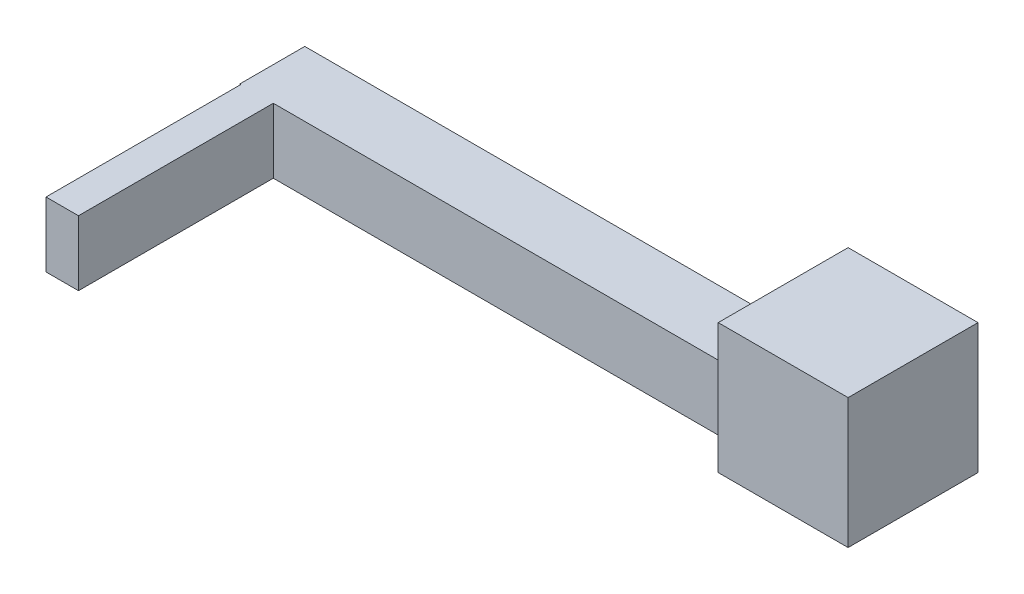
ISO-10303-21;
HEADER;
FILE_DESCRIPTION(('STEP AP214'),'2;1');
FILE_NAME('part.step','',(''),(''),'','','');
FILE_SCHEMA(('AUTOMOTIVE_DESIGN { 1 0 10303 214 1 1 1 1 }'));
ENDSEC;
DATA;
#1=APPLICATION_CONTEXT('core data for automotive mechanical design processes');
#2=APPLICATION_PROTOCOL_DEFINITION('international standard','automotive_design',2000,#1);
#3=PRODUCT_CONTEXT('',#1,'mechanical');
#4=PRODUCT('Part','Part','',(#3));
#5=PRODUCT_RELATED_PRODUCT_CATEGORY('part','',(#4));
#6=PRODUCT_DEFINITION_FORMATION('','',#4);
#7=PRODUCT_DEFINITION_CONTEXT('part definition',#1,'design');
#8=PRODUCT_DEFINITION('design','',#6,#7);
#9=PRODUCT_DEFINITION_SHAPE('','',#8);
#10=(LENGTH_UNIT() NAMED_UNIT(*) SI_UNIT(.MILLI.,.METRE.));
#11=(NAMED_UNIT(*) PLANE_ANGLE_UNIT() SI_UNIT($,.RADIAN.));
#12=(NAMED_UNIT(*) SI_UNIT($,.STERADIAN.) SOLID_ANGLE_UNIT());
#13=UNCERTAINTY_MEASURE_WITH_UNIT(LENGTH_MEASURE(1.E-05),#10,'distance_accuracy_value','');
#14=(GEOMETRIC_REPRESENTATION_CONTEXT(3) GLOBAL_UNCERTAINTY_ASSIGNED_CONTEXT((#13)) GLOBAL_UNIT_ASSIGNED_CONTEXT((#10,
#11,#12)) REPRESENTATION_CONTEXT('',''));
#15=CARTESIAN_POINT('',(0.,0.,0.));
#16=DIRECTION('',(0.,0.,1.));
#17=DIRECTION('',(1.,0.,0.));
#18=AXIS2_PLACEMENT_3D('',#15,#16,#17);
#19=CARTESIAN_POINT('',(40.,10.,5.));
#20=DIRECTION('',(0.,0.,-1.));
#21=DIRECTION('',(-1.,0.,0.));
#22=AXIS2_PLACEMENT_3D('',#19,#20,#21);
#23=PLANE('',#22);
#24=DIRECTION('',(0.,-1.,0.));
#25=VECTOR('',#24,1.);
#26=CARTESIAN_POINT('',(-39.8451970487685,10.,5.00000000000001));
#27=LINE('',#26,#25);
#28=CARTESIAN_POINT('',(-39.8451970487685,10.,5.00000000000001));
#29=VERTEX_POINT('',#28);
#30=CARTESIAN_POINT('',(-39.8451970487685,0.,5.00000000000001));
#31=VERTEX_POINT('',#30);
#32=EDGE_CURVE('E56',#29,#31,#27,.T.);
#33=ORIENTED_EDGE('',*,*,#32,.F.);
#34=DIRECTION('',(1.,0.,0.));
#35=VECTOR('',#34,1.);
#36=CARTESIAN_POINT('',(40.,10.,5.));
#37=LINE('',#36,#35);
#38=CARTESIAN_POINT('',(-40.,10.,5.00000000000001));
#39=VERTEX_POINT('',#38);
#40=EDGE_CURVE('E140',#39,#29,#37,.T.);
#41=ORIENTED_EDGE('',*,*,#40,.F.);
#42=DIRECTION('',(0.,-1.,0.));
#43=VECTOR('',#42,1.);
#44=CARTESIAN_POINT('',(-40.,10.,5.00000000000001));
#45=LINE('',#44,#43);
#46=CARTESIAN_POINT('',(-40.,0.,5.00000000000001));
#47=VERTEX_POINT('',#46);
#48=EDGE_CURVE('E168',#39,#47,#45,.T.);
#49=ORIENTED_EDGE('',*,*,#48,.T.);
#50=DIRECTION('',(1.,0.,0.));
#51=VECTOR('',#50,1.);
#52=CARTESIAN_POINT('',(40.,0.,5.));
#53=LINE('',#52,#51);
#54=EDGE_CURVE('E163',#47,#31,#53,.T.);
#55=ORIENTED_EDGE('',*,*,#54,.T.);
#56=EDGE_LOOP('',(#33,#41,#49,#55));
#57=FACE_BOUND('',#56,.T.);
#58=ADVANCED_FACE('F33',(#57),#23,.F.);
#59=DIRECTION('',(0.,-1.,0.));
#60=VECTOR('',#59,1.);
#61=CARTESIAN_POINT('',(-34.8451970487685,10.,5.00000000000001));
#62=LINE('',#61,#60);
#63=CARTESIAN_POINT('',(-34.8451970487685,10.,5.00000000000001));
#64=VERTEX_POINT('',#63);
#65=CARTESIAN_POINT('',(-34.8451970487685,0.,5.00000000000001));
#66=VERTEX_POINT('',#65);
#67=EDGE_CURVE('E152',#64,#66,#62,.T.);
#68=ORIENTED_EDGE('',*,*,#67,.T.);
#69=CARTESIAN_POINT('',(38.6544418153938,0.,5.));
#70=VERTEX_POINT('',#69);
#71=EDGE_CURVE('E150',#66,#70,#53,.T.);
#72=ORIENTED_EDGE('',*,*,#71,.T.);
#73=DIRECTION('',(0.,1.,0.));
#74=VECTOR('',#73,1.);
#75=CARTESIAN_POINT('',(38.6544418153938,20.,5.));
#76=LINE('',#75,#74);
#77=CARTESIAN_POINT('',(38.6544418153938,10.,5.00000000000001));
#78=VERTEX_POINT('',#77);
#79=EDGE_CURVE('E174',#70,#78,#76,.T.);
#80=ORIENTED_EDGE('',*,*,#79,.T.);
#81=EDGE_CURVE('E48',#64,#78,#37,.T.);
#82=ORIENTED_EDGE('',*,*,#81,.F.);
#83=EDGE_LOOP('',(#68,#72,#80,#82));
#84=FACE_BOUND('',#83,.T.);
#85=ADVANCED_FACE('F237',(#84),#23,.F.);
#86=CARTESIAN_POINT('',(38.6544418153938,20.,10.));
#87=DIRECTION('',(1.,0.,0.));
#88=DIRECTION('',(0.,0.,-1.));
#89=AXIS2_PLACEMENT_3D('',#86,#87,#88);
#90=PLANE('',#89);
#91=ORIENTED_EDGE('',*,*,#79,.F.);
#92=DIRECTION('',(0.,0.,1.));
#93=VECTOR('',#92,1.);
#94=CARTESIAN_POINT('',(38.6544418153938,0.,10.));
#95=LINE('',#94,#93);
#96=CARTESIAN_POINT('',(38.6544418153938,0.,10.));
#97=VERTEX_POINT('',#96);
#98=EDGE_CURVE('E176',#70,#97,#95,.T.);
#99=ORIENTED_EDGE('',*,*,#98,.T.);
#100=DIRECTION('',(0.,-1.,0.));
#101=VECTOR('',#100,1.);
#102=CARTESIAN_POINT('',(38.6544418153938,20.,10.));
#103=LINE('',#102,#101);
#104=CARTESIAN_POINT('',(38.6544418153938,20.,10.));
#105=VERTEX_POINT('',#104);
#106=EDGE_CURVE('E41',#105,#97,#103,.T.);
#107=ORIENTED_EDGE('',*,*,#106,.F.);
#108=DIRECTION('',(0.,0.,1.));
#109=VECTOR('',#108,1.);
#110=CARTESIAN_POINT('',(38.6544418153938,20.,10.));
#111=LINE('',#110,#109);
#112=CARTESIAN_POINT('',(38.6544418153938,20.,-10.));
#113=VERTEX_POINT('',#112);
#114=EDGE_CURVE('E177',#113,#105,#111,.T.);
#115=ORIENTED_EDGE('',*,*,#114,.F.);
#116=DIRECTION('',(0.,-1.,0.));
#117=VECTOR('',#116,1.);
#118=CARTESIAN_POINT('',(38.6544418153938,20.,-10.));
#119=LINE('',#118,#117);
#120=CARTESIAN_POINT('',(38.6544418153938,0.,-10.));
#121=VERTEX_POINT('',#120);
#122=EDGE_CURVE('E187',#113,#121,#119,.T.);
#123=ORIENTED_EDGE('',*,*,#122,.T.);
#124=CARTESIAN_POINT('',(38.6544418153938,0.,-5.));
#125=VERTEX_POINT('',#124);
#126=EDGE_CURVE('E188',#121,#125,#95,.T.);
#127=ORIENTED_EDGE('',*,*,#126,.T.);
#128=DIRECTION('',(0.,-1.,0.));
#129=VECTOR('',#128,1.);
#130=CARTESIAN_POINT('',(38.6544418153938,20.,-5.));
#131=LINE('',#130,#129);
#132=CARTESIAN_POINT('',(38.6544418153938,10.,-5.));
#133=VERTEX_POINT('',#132);
#134=EDGE_CURVE('E171',#133,#125,#131,.T.);
#135=ORIENTED_EDGE('',*,*,#134,.F.);
#136=DIRECTION('',(0.,0.,1.));
#137=VECTOR('',#136,1.);
#138=CARTESIAN_POINT('',(38.6544418153938,10.,10.));
#139=LINE('',#138,#137);
#140=EDGE_CURVE('E11',#133,#78,#139,.T.);
#141=ORIENTED_EDGE('',*,*,#140,.T.);
#142=EDGE_LOOP('',(#91,#99,#107,#115,#123,#127,#135,#141));
#143=FACE_BOUND('',#142,.T.);
#144=ADVANCED_FACE('F35',(#143),#90,.F.);
#145=CARTESIAN_POINT('',(58.6544418153938,20.,10.));
#146=DIRECTION('',(0.,0.,-1.));
#147=DIRECTION('',(-1.,0.,0.));
#148=AXIS2_PLACEMENT_3D('',#145,#146,#147);
#149=PLANE('',#148);
#150=DIRECTION('',(1.,0.,0.));
#151=VECTOR('',#150,1.);
#152=CARTESIAN_POINT('',(58.6544418153938,0.,10.));
#153=LINE('',#152,#151);
#154=CARTESIAN_POINT('',(58.6544418153938,0.,10.));
#155=VERTEX_POINT('',#154);
#156=EDGE_CURVE('E190',#97,#155,#153,.T.);
#157=ORIENTED_EDGE('',*,*,#156,.T.);
#158=DIRECTION('',(0.,-1.,0.));
#159=VECTOR('',#158,1.);
#160=CARTESIAN_POINT('',(58.6544418153938,20.,10.));
#161=LINE('',#160,#159);
#162=CARTESIAN_POINT('',(58.6544418153938,20.,10.));
#163=VERTEX_POINT('',#162);
#164=EDGE_CURVE('E200',#163,#155,#161,.T.);
#165=ORIENTED_EDGE('',*,*,#164,.F.);
#166=DIRECTION('',(1.,0.,0.));
#167=VECTOR('',#166,1.);
#168=CARTESIAN_POINT('',(58.6544418153938,20.,10.));
#169=LINE('',#168,#167);
#170=EDGE_CURVE('E180',#105,#163,#169,.T.);
#171=ORIENTED_EDGE('',*,*,#170,.F.);
#172=ORIENTED_EDGE('',*,*,#106,.T.);
#173=EDGE_LOOP('',(#157,#165,#171,#172));
#174=FACE_BOUND('',#173,.T.);
#175=ADVANCED_FACE('F205',(#174),#149,.F.);
#176=CARTESIAN_POINT('',(58.6544418153938,20.,10.));
#177=DIRECTION('',(-1.,0.,0.));
#178=DIRECTION('',(0.,0.,1.));
#179=AXIS2_PLACEMENT_3D('',#176,#177,#178);
#180=PLANE('',#179);
#181=DIRECTION('',(0.,0.,-1.));
#182=VECTOR('',#181,1.);
#183=CARTESIAN_POINT('',(58.6544418153938,0.,10.));
#184=LINE('',#183,#182);
#185=CARTESIAN_POINT('',(58.6544418153938,0.,-10.));
#186=VERTEX_POINT('',#185);
#187=EDGE_CURVE('E192',#155,#186,#184,.T.);
#188=ORIENTED_EDGE('',*,*,#187,.T.);
#189=DIRECTION('',(0.,-1.,0.));
#190=VECTOR('',#189,1.);
#191=CARTESIAN_POINT('',(58.6544418153938,20.,-10.));
#192=LINE('',#191,#190);
#193=CARTESIAN_POINT('',(58.6544418153938,20.,-10.));
#194=VERTEX_POINT('',#193);
#195=EDGE_CURVE('E197',#194,#186,#192,.T.);
#196=ORIENTED_EDGE('',*,*,#195,.F.);
#197=DIRECTION('',(0.,0.,-1.));
#198=VECTOR('',#197,1.);
#199=CARTESIAN_POINT('',(58.6544418153938,20.,10.));
#200=LINE('',#199,#198);
#201=EDGE_CURVE('E183',#163,#194,#200,.T.);
#202=ORIENTED_EDGE('',*,*,#201,.F.);
#203=ORIENTED_EDGE('',*,*,#164,.T.);
#204=EDGE_LOOP('',(#188,#196,#202,#203));
#205=FACE_BOUND('',#204,.T.);
#206=ADVANCED_FACE('F219',(#205),#180,.F.);
#207=CARTESIAN_POINT('',(58.6544418153938,20.,-10.));
#208=DIRECTION('',(0.,0.,1.));
#209=DIRECTION('',(1.,0.,0.));
#210=AXIS2_PLACEMENT_3D('',#207,#208,#209);
#211=PLANE('',#210);
#212=DIRECTION('',(-1.,0.,0.));
#213=VECTOR('',#212,1.);
#214=CARTESIAN_POINT('',(58.6544418153938,0.,-10.));
#215=LINE('',#214,#213);
#216=EDGE_CURVE('E181',#186,#121,#215,.T.);
#217=ORIENTED_EDGE('',*,*,#216,.T.);
#218=ORIENTED_EDGE('',*,*,#122,.F.);
#219=DIRECTION('',(-1.,0.,0.));
#220=VECTOR('',#219,1.);
#221=CARTESIAN_POINT('',(58.6544418153938,20.,-10.));
#222=LINE('',#221,#220);
#223=EDGE_CURVE('E185',#194,#113,#222,.T.);
#224=ORIENTED_EDGE('',*,*,#223,.F.);
#225=ORIENTED_EDGE('',*,*,#195,.T.);
#226=EDGE_LOOP('',(#217,#218,#224,#225));
#227=FACE_BOUND('',#226,.T.);
#228=ADVANCED_FACE('F223',(#227),#211,.F.);
#229=CARTESIAN_POINT('',(0.,20.,0.));
#230=DIRECTION('',(0.,1.,0.));
#231=DIRECTION('',(0.,0.,1.));
#232=AXIS2_PLACEMENT_3D('',#229,#230,#231);
#233=PLANE('',#232);
#234=ORIENTED_EDGE('',*,*,#114,.T.);
#235=ORIENTED_EDGE('',*,*,#170,.T.);
#236=ORIENTED_EDGE('',*,*,#201,.T.);
#237=ORIENTED_EDGE('',*,*,#223,.T.);
#238=EDGE_LOOP('',(#234,#235,#236,#237));
#239=FACE_BOUND('',#238,.T.);
#240=ADVANCED_FACE('F226',(#239),#233,.T.);
#241=CARTESIAN_POINT('',(0.,0.,0.));
#242=DIRECTION('',(0.,1.,0.));
#243=DIRECTION('',(0.,0.,1.));
#244=AXIS2_PLACEMENT_3D('',#241,#242,#243);
#245=PLANE('',#244);
#246=ORIENTED_EDGE('',*,*,#98,.F.);
#247=ORIENTED_EDGE('',*,*,#71,.F.);
#248=DIRECTION('',(0.,0.,-1.));
#249=VECTOR('',#248,1.);
#250=CARTESIAN_POINT('',(-34.8451970487685,0.,35.));
#251=LINE('',#250,#249);
#252=CARTESIAN_POINT('',(-34.8451970487685,0.,35.));
#253=VERTEX_POINT('',#252);
#254=EDGE_CURVE('E142',#253,#66,#251,.T.);
#255=ORIENTED_EDGE('',*,*,#254,.F.);
#256=DIRECTION('',(1.,0.,0.));
#257=VECTOR('',#256,1.);
#258=CARTESIAN_POINT('',(-34.8451970487685,0.,35.));
#259=LINE('',#258,#257);
#260=CARTESIAN_POINT('',(-39.8451970487685,0.,35.));
#261=VERTEX_POINT('',#260);
#262=EDGE_CURVE('E263',#261,#253,#259,.T.);
#263=ORIENTED_EDGE('',*,*,#262,.F.);
#264=DIRECTION('',(0.,0.,1.));
#265=VECTOR('',#264,1.);
#266=CARTESIAN_POINT('',(-39.8451970487685,0.,35.));
#267=LINE('',#266,#265);
#268=EDGE_CURVE('E146',#31,#261,#267,.T.);
#269=ORIENTED_EDGE('',*,*,#268,.F.);
#270=ORIENTED_EDGE('',*,*,#54,.F.);
#271=DIRECTION('',(0.,0.,1.));
#272=VECTOR('',#271,1.);
#273=CARTESIAN_POINT('',(-40.,0.,5.00000000000001));
#274=LINE('',#273,#272);
#275=CARTESIAN_POINT('',(-40.,0.,-4.99999999999999));
#276=VERTEX_POINT('',#275);
#277=EDGE_CURVE('E147',#276,#47,#274,.T.);
#278=ORIENTED_EDGE('',*,*,#277,.F.);
#279=DIRECTION('',(-1.,0.,0.));
#280=VECTOR('',#279,1.);
#281=CARTESIAN_POINT('',(40.,0.,-5.));
#282=LINE('',#281,#280);
#283=EDGE_CURVE('E158',#125,#276,#282,.T.);
#284=ORIENTED_EDGE('',*,*,#283,.F.);
#285=ORIENTED_EDGE('',*,*,#126,.F.);
#286=ORIENTED_EDGE('',*,*,#216,.F.);
#287=ORIENTED_EDGE('',*,*,#187,.F.);
#288=ORIENTED_EDGE('',*,*,#156,.F.);
#289=EDGE_LOOP('',(#246,#247,#255,#263,#269,#270,#278,#284,#285,#286,#287,#288));
#290=FACE_BOUND('',#289,.T.);
#291=ADVANCED_FACE('F214',(#290),#245,.F.);
#292=CARTESIAN_POINT('',(0.,10.,0.));
#293=DIRECTION('',(0.,1.,0.));
#294=DIRECTION('',(0.,0.,1.));
#295=AXIS2_PLACEMENT_3D('',#292,#293,#294);
#296=PLANE('',#295);
#297=ORIENTED_EDGE('',*,*,#140,.F.);
#298=DIRECTION('',(-1.,0.,0.));
#299=VECTOR('',#298,1.);
#300=CARTESIAN_POINT('',(40.,10.,-5.));
#301=LINE('',#300,#299);
#302=CARTESIAN_POINT('',(-40.,10.,-4.99999999999999));
#303=VERTEX_POINT('',#302);
#304=EDGE_CURVE('E160',#133,#303,#301,.T.);
#305=ORIENTED_EDGE('',*,*,#304,.T.);
#306=DIRECTION('',(0.,0.,1.));
#307=VECTOR('',#306,1.);
#308=CARTESIAN_POINT('',(-40.,10.,5.00000000000001));
#309=LINE('',#308,#307);
#310=EDGE_CURVE('E156',#303,#39,#309,.T.);
#311=ORIENTED_EDGE('',*,*,#310,.T.);
#312=ORIENTED_EDGE('',*,*,#40,.T.);
#313=DIRECTION('',(0.,0.,1.));
#314=VECTOR('',#313,1.);
#315=CARTESIAN_POINT('',(-39.8451970487685,10.,35.));
#316=LINE('',#315,#314);
#317=CARTESIAN_POINT('',(-39.8451970487685,10.,35.));
#318=VERTEX_POINT('',#317);
#319=EDGE_CURVE('E134',#29,#318,#316,.T.);
#320=ORIENTED_EDGE('',*,*,#319,.T.);
#321=DIRECTION('',(1.,0.,0.));
#322=VECTOR('',#321,1.);
#323=CARTESIAN_POINT('',(-34.8451970487685,10.,35.));
#324=LINE('',#323,#322);
#325=CARTESIAN_POINT('',(-34.8451970487685,10.,35.));
#326=VERTEX_POINT('',#325);
#327=EDGE_CURVE('E123',#318,#326,#324,.T.);
#328=ORIENTED_EDGE('',*,*,#327,.T.);
#329=DIRECTION('',(0.,0.,-1.));
#330=VECTOR('',#329,1.);
#331=CARTESIAN_POINT('',(-34.8451970487685,10.,35.));
#332=LINE('',#331,#330);
#333=EDGE_CURVE('E133',#326,#64,#332,.T.);
#334=ORIENTED_EDGE('',*,*,#333,.T.);
#335=ORIENTED_EDGE('',*,*,#81,.T.);
#336=EDGE_LOOP('',(#297,#305,#311,#312,#320,#328,#334,#335));
#337=FACE_BOUND('',#336,.T.);
#338=ADVANCED_FACE('F138',(#337),#296,.T.);
#339=CARTESIAN_POINT('',(40.,10.,-5.));
#340=DIRECTION('',(0.,0.,1.));
#341=DIRECTION('',(1.,0.,0.));
#342=AXIS2_PLACEMENT_3D('',#339,#340,#341);
#343=PLANE('',#342);
#344=ORIENTED_EDGE('',*,*,#304,.F.);
#345=ORIENTED_EDGE('',*,*,#134,.T.);
#346=ORIENTED_EDGE('',*,*,#283,.T.);
#347=DIRECTION('',(0.,-1.,0.));
#348=VECTOR('',#347,1.);
#349=CARTESIAN_POINT('',(-40.,10.,-4.99999999999999));
#350=LINE('',#349,#348);
#351=EDGE_CURVE('E161',#303,#276,#350,.T.);
#352=ORIENTED_EDGE('',*,*,#351,.F.);
#353=EDGE_LOOP('',(#344,#345,#346,#352));
#354=FACE_BOUND('',#353,.T.);
#355=ADVANCED_FACE('F243',(#354),#343,.F.);
#356=CARTESIAN_POINT('',(-40.,10.,5.00000000000001));
#357=DIRECTION('',(1.,0.,0.));
#358=DIRECTION('',(0.,0.,-1.));
#359=AXIS2_PLACEMENT_3D('',#356,#357,#358);
#360=PLANE('',#359);
#361=ORIENTED_EDGE('',*,*,#277,.T.);
#362=ORIENTED_EDGE('',*,*,#48,.F.);
#363=ORIENTED_EDGE('',*,*,#310,.F.);
#364=ORIENTED_EDGE('',*,*,#351,.T.);
#365=EDGE_LOOP('',(#361,#362,#363,#364));
#366=FACE_BOUND('',#365,.T.);
#367=ADVANCED_FACE('F245',(#366),#360,.F.);
#368=CARTESIAN_POINT('',(-39.8451970487685,10.,35.));
#369=DIRECTION('',(1.,0.,0.));
#370=DIRECTION('',(0.,0.,-1.));
#371=AXIS2_PLACEMENT_3D('',#368,#369,#370);
#372=PLANE('',#371);
#373=ORIENTED_EDGE('',*,*,#268,.T.);
#374=DIRECTION('',(0.,-1.,0.));
#375=VECTOR('',#374,1.);
#376=CARTESIAN_POINT('',(-39.8451970487685,10.,35.));
#377=LINE('',#376,#375);
#378=EDGE_CURVE('E127',#318,#261,#377,.T.);
#379=ORIENTED_EDGE('',*,*,#378,.F.);
#380=ORIENTED_EDGE('',*,*,#319,.F.);
#381=ORIENTED_EDGE('',*,*,#32,.T.);
#382=EDGE_LOOP('',(#373,#379,#380,#381));
#383=FACE_BOUND('',#382,.T.);
#384=ADVANCED_FACE('F144',(#383),#372,.F.);
#385=CARTESIAN_POINT('',(-34.8451970487685,10.,35.));
#386=DIRECTION('',(0.,0.,-1.));
#387=DIRECTION('',(-1.,0.,0.));
#388=AXIS2_PLACEMENT_3D('',#385,#386,#387);
#389=PLANE('',#388);
#390=ORIENTED_EDGE('',*,*,#262,.T.);
#391=DIRECTION('',(0.,-1.,0.));
#392=VECTOR('',#391,1.);
#393=CARTESIAN_POINT('',(-34.8451970487685,10.,35.));
#394=LINE('',#393,#392);
#395=EDGE_CURVE('E130',#326,#253,#394,.T.);
#396=ORIENTED_EDGE('',*,*,#395,.F.);
#397=ORIENTED_EDGE('',*,*,#327,.F.);
#398=ORIENTED_EDGE('',*,*,#378,.T.);
#399=EDGE_LOOP('',(#390,#396,#397,#398));
#400=FACE_BOUND('',#399,.T.);
#401=ADVANCED_FACE('F125',(#400),#389,.F.);
#402=CARTESIAN_POINT('',(-34.8451970487685,10.,35.));
#403=DIRECTION('',(-1.,0.,0.));
#404=DIRECTION('',(0.,0.,1.));
#405=AXIS2_PLACEMENT_3D('',#402,#403,#404);
#406=PLANE('',#405);
#407=ORIENTED_EDGE('',*,*,#254,.T.);
#408=ORIENTED_EDGE('',*,*,#67,.F.);
#409=ORIENTED_EDGE('',*,*,#333,.F.);
#410=ORIENTED_EDGE('',*,*,#395,.T.);
#411=EDGE_LOOP('',(#407,#408,#409,#410));
#412=FACE_BOUND('',#411,.T.);
#413=ADVANCED_FACE('F270',(#412),#406,.F.);
#414=CLOSED_SHELL('',(#58,#85,#144,#175,#206,#228,#240,#291,#338,#355,#367,#384,#401,#413));
#415=MANIFOLD_SOLID_BREP('B2',#414);
#416=ADVANCED_BREP_SHAPE_REPRESENTATION('',(#18,#415),#14);
#417=SHAPE_DEFINITION_REPRESENTATION(#9,#416);
ENDSEC;
END-ISO-10303-21;
